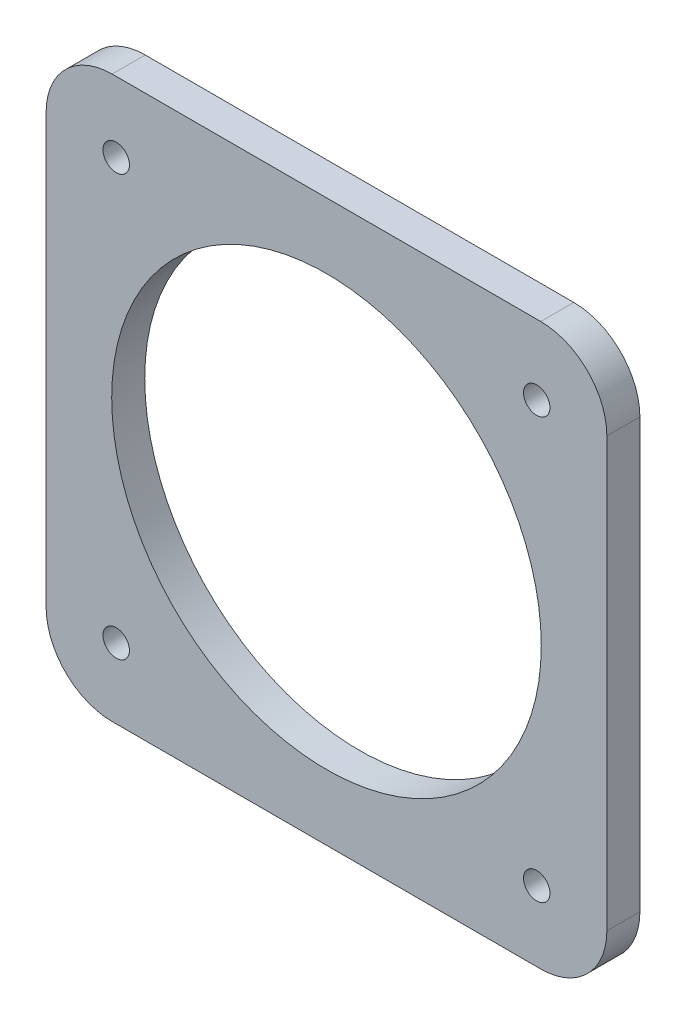
ISO-10303-21;
HEADER;
FILE_DESCRIPTION(('STEP AP214'),'2;1');
FILE_NAME('part.step','',(''),(''),'','','');
FILE_SCHEMA(('AUTOMOTIVE_DESIGN { 1 0 10303 214 1 1 1 1 }'));
ENDSEC;
DATA;
#1=APPLICATION_CONTEXT('core data for automotive mechanical design processes');
#2=APPLICATION_PROTOCOL_DEFINITION('international standard','automotive_design',2000,#1);
#3=PRODUCT_CONTEXT('',#1,'mechanical');
#4=PRODUCT('Part','Part','',(#3));
#5=PRODUCT_RELATED_PRODUCT_CATEGORY('part','',(#4));
#6=PRODUCT_DEFINITION_FORMATION('','',#4);
#7=PRODUCT_DEFINITION_CONTEXT('part definition',#1,'design');
#8=PRODUCT_DEFINITION('design','',#6,#7);
#9=PRODUCT_DEFINITION_SHAPE('','',#8);
#10=(LENGTH_UNIT() NAMED_UNIT(*) SI_UNIT(.MILLI.,.METRE.));
#11=(NAMED_UNIT(*) PLANE_ANGLE_UNIT() SI_UNIT($,.RADIAN.));
#12=(NAMED_UNIT(*) SI_UNIT($,.STERADIAN.) SOLID_ANGLE_UNIT());
#13=UNCERTAINTY_MEASURE_WITH_UNIT(LENGTH_MEASURE(1.E-05),#10,'distance_accuracy_value','');
#14=(GEOMETRIC_REPRESENTATION_CONTEXT(3) GLOBAL_UNCERTAINTY_ASSIGNED_CONTEXT((#13)) GLOBAL_UNIT_ASSIGNED_CONTEXT((#10,
#11,#12)) REPRESENTATION_CONTEXT('',''));
#15=CARTESIAN_POINT('',(0.,0.,0.));
#16=DIRECTION('',(0.,0.,1.));
#17=DIRECTION('',(1.,0.,0.));
#18=AXIS2_PLACEMENT_3D('',#15,#16,#17);
#19=CARTESIAN_POINT('',(59.3145246333828,55.4306557917285,5.));
#20=DIRECTION('',(0.,0.,-1.));
#21=DIRECTION('',(-1.,0.,0.));
#22=AXIS2_PLACEMENT_3D('',#19,#20,#21);
#23=PLANE('',#22);
#24=CARTESIAN_POINT('',(59.3145246333828,55.4306557917285,5.));
#25=DIRECTION('',(0.,0.,1.));
#26=DIRECTION('',(-1.,0.,0.));
#27=AXIS2_PLACEMENT_3D('',#24,#25,#26);
#28=CIRCLE('',#27,9.99999999999999);
#29=CARTESIAN_POINT('',(69.3145246333828,55.4306557917284,5.));
#30=VERTEX_POINT('',#29);
#31=CARTESIAN_POINT('',(59.3145246333827,65.4306557917285,5.));
#32=VERTEX_POINT('',#31);
#33=EDGE_CURVE('E145',#30,#32,#28,.T.);
#34=ORIENTED_EDGE('',*,*,#33,.T.);
#35=DIRECTION('',(-1.,0.,0.));
#36=VECTOR('',#35,1.);
#37=CARTESIAN_POINT('',(-5.53547536661714,65.4306557917285,5.));
#38=LINE('',#37,#36);
#39=CARTESIAN_POINT('',(-5.53547536661714,65.4306557917285,5.));
#40=VERTEX_POINT('',#39);
#41=EDGE_CURVE('E93',#32,#40,#38,.T.);
#42=ORIENTED_EDGE('',*,*,#41,.T.);
#43=CARTESIAN_POINT('',(-5.53547536661721,55.4306557917285,5.));
#44=DIRECTION('',(0.,0.,1.));
#45=DIRECTION('',(1.,0.,0.));
#46=AXIS2_PLACEMENT_3D('',#43,#44,#45);
#47=CIRCLE('',#46,10.);
#48=CARTESIAN_POINT('',(-15.5354753666172,55.4306557917284,5.));
#49=VERTEX_POINT('',#48);
#50=EDGE_CURVE('E160',#40,#49,#47,.T.);
#51=ORIENTED_EDGE('',*,*,#50,.T.);
#52=DIRECTION('',(0.,-1.,0.));
#53=VECTOR('',#52,1.);
#54=CARTESIAN_POINT('',(-15.5354753666172,55.4306557917284,5.));
#55=LINE('',#54,#53);
#56=CARTESIAN_POINT('',(-15.5354753666172,-9.41934420827146,5.));
#57=VERTEX_POINT('',#56);
#58=EDGE_CURVE('E173',#49,#57,#55,.T.);
#59=ORIENTED_EDGE('',*,*,#58,.T.);
#60=CARTESIAN_POINT('',(-5.5354753666172,-9.41934420827153,5.));
#61=DIRECTION('',(0.,0.,1.));
#62=DIRECTION('',(1.,0.,0.));
#63=AXIS2_PLACEMENT_3D('',#60,#61,#62);
#64=CIRCLE('',#63,10.);
#65=CARTESIAN_POINT('',(-5.53547536661713,-19.4193442082715,5.));
#66=VERTEX_POINT('',#65);
#67=EDGE_CURVE('E112',#57,#66,#64,.T.);
#68=ORIENTED_EDGE('',*,*,#67,.T.);
#69=DIRECTION('',(1.,0.,0.));
#70=VECTOR('',#69,1.);
#71=CARTESIAN_POINT('',(-5.53547536661713,-19.4193442082715,5.));
#72=LINE('',#71,#70);
#73=CARTESIAN_POINT('',(59.3145246333827,-19.4193442082715,5.));
#74=VERTEX_POINT('',#73);
#75=EDGE_CURVE('E106',#66,#74,#72,.T.);
#76=ORIENTED_EDGE('',*,*,#75,.T.);
#77=CARTESIAN_POINT('',(59.3145246333828,-9.41934420827153,5.));
#78=DIRECTION('',(0.,0.,1.));
#79=DIRECTION('',(1.,0.,0.));
#80=AXIS2_PLACEMENT_3D('',#77,#78,#79);
#81=CIRCLE('',#80,10.);
#82=CARTESIAN_POINT('',(69.3145246333828,-9.41934420827153,5.));
#83=VERTEX_POINT('',#82);
#84=EDGE_CURVE('E110',#74,#83,#81,.T.);
#85=ORIENTED_EDGE('',*,*,#84,.T.);
#86=DIRECTION('',(0.,1.,0.));
#87=VECTOR('',#86,1.);
#88=CARTESIAN_POINT('',(69.3145246333828,55.4306557917284,5.));
#89=LINE('',#88,#87);
#90=EDGE_CURVE('E50',#83,#30,#89,.T.);
#91=ORIENTED_EDGE('',*,*,#90,.T.);
#92=EDGE_LOOP('',(#34,#42,#51,#59,#68,#76,#85,#91));
#93=FACE_BOUND('',#92,.T.);
#94=CARTESIAN_POINT('',(26.8895246333828,23.0056557917285,5.));
#95=DIRECTION('',(0.,0.,1.));
#96=DIRECTION('',(1.,0.,0.));
#97=AXIS2_PLACEMENT_3D('',#94,#95,#96);
#98=CIRCLE('',#97,32.5);
#99=CARTESIAN_POINT('',(59.3895246333828,23.0056557917285,5.));
#100=VERTEX_POINT('',#99);
#101=EDGE_CURVE('E134',#100,#100,#98,.T.);
#102=ORIENTED_EDGE('',*,*,#101,.F.);
#103=EDGE_LOOP('',(#102));
#104=FACE_BOUND('',#103,.T.);
#105=CARTESIAN_POINT('',(-4.92547536661721,54.8206557917285,5.));
#106=DIRECTION('',(0.,0.,1.));
#107=DIRECTION('',(1.,0.,0.));
#108=AXIS2_PLACEMENT_3D('',#105,#106,#107);
#109=CIRCLE('',#108,2.);
#110=CARTESIAN_POINT('',(-2.92547536661721,54.8206557917285,5.));
#111=VERTEX_POINT('',#110);
#112=EDGE_CURVE('E182',#111,#111,#109,.T.);
#113=ORIENTED_EDGE('',*,*,#112,.F.);
#114=EDGE_LOOP('',(#113));
#115=FACE_BOUND('',#114,.T.);
#116=CARTESIAN_POINT('',(-4.92547536661721,-8.80934420827153,5.));
#117=DIRECTION('',(0.,0.,1.));
#118=DIRECTION('',(1.,0.,0.));
#119=AXIS2_PLACEMENT_3D('',#116,#117,#118);
#120=CIRCLE('',#119,2.);
#121=CARTESIAN_POINT('',(-2.92547536661721,-8.80934420827153,5.));
#122=VERTEX_POINT('',#121);
#123=EDGE_CURVE('E188',#122,#122,#120,.T.);
#124=ORIENTED_EDGE('',*,*,#123,.F.);
#125=EDGE_LOOP('',(#124));
#126=FACE_BOUND('',#125,.T.);
#127=CARTESIAN_POINT('',(58.7045246333828,54.8206557917285,5.));
#128=DIRECTION('',(0.,0.,1.));
#129=DIRECTION('',(1.,0.,0.));
#130=AXIS2_PLACEMENT_3D('',#127,#128,#129);
#131=CIRCLE('',#130,2.);
#132=CARTESIAN_POINT('',(60.7045246333828,54.8206557917285,5.));
#133=VERTEX_POINT('',#132);
#134=EDGE_CURVE('E194',#133,#133,#131,.T.);
#135=ORIENTED_EDGE('',*,*,#134,.F.);
#136=EDGE_LOOP('',(#135));
#137=FACE_BOUND('',#136,.T.);
#138=CARTESIAN_POINT('',(58.7045246333828,-8.80934420827153,5.));
#139=DIRECTION('',(0.,0.,1.));
#140=DIRECTION('',(1.,0.,0.));
#141=AXIS2_PLACEMENT_3D('',#138,#139,#140);
#142=CIRCLE('',#141,2.);
#143=CARTESIAN_POINT('',(60.7045246333828,-8.80934420827153,5.));
#144=VERTEX_POINT('',#143);
#145=EDGE_CURVE('E200',#144,#144,#142,.T.);
#146=ORIENTED_EDGE('',*,*,#145,.F.);
#147=EDGE_LOOP('',(#146));
#148=FACE_BOUND('',#147,.T.);
#149=ADVANCED_FACE('F33',(#93,#104,#115,#126,#137,#148),#23,.F.);
#150=CARTESIAN_POINT('',(59.3145246333828,55.4306557917285,0.));
#151=DIRECTION('',(0.,0.,-1.));
#152=DIRECTION('',(-1.,0.,0.));
#153=AXIS2_PLACEMENT_3D('',#150,#151,#152);
#154=PLANE('',#153);
#155=CARTESIAN_POINT('',(58.7045246333828,54.8206557917285,0.));
#156=DIRECTION('',(0.,0.,1.));
#157=DIRECTION('',(1.,0.,0.));
#158=AXIS2_PLACEMENT_3D('',#155,#156,#157);
#159=CIRCLE('',#158,2.);
#160=CARTESIAN_POINT('',(60.7045246333828,54.8206557917285,0.));
#161=VERTEX_POINT('',#160);
#162=EDGE_CURVE('E197',#161,#161,#159,.T.);
#163=ORIENTED_EDGE('',*,*,#162,.T.);
#164=EDGE_LOOP('',(#163));
#165=FACE_BOUND('',#164,.T.);
#166=CARTESIAN_POINT('',(-4.92547536661721,54.8206557917285,0.));
#167=DIRECTION('',(0.,0.,1.));
#168=DIRECTION('',(1.,0.,0.));
#169=AXIS2_PLACEMENT_3D('',#166,#167,#168);
#170=CIRCLE('',#169,2.);
#171=CARTESIAN_POINT('',(-2.92547536661721,54.8206557917285,0.));
#172=VERTEX_POINT('',#171);
#173=EDGE_CURVE('E185',#172,#172,#170,.T.);
#174=ORIENTED_EDGE('',*,*,#173,.T.);
#175=EDGE_LOOP('',(#174));
#176=FACE_BOUND('',#175,.T.);
#177=CARTESIAN_POINT('',(59.3145246333828,55.4306557917285,0.));
#178=DIRECTION('',(0.,0.,1.));
#179=DIRECTION('',(-1.,0.,0.));
#180=AXIS2_PLACEMENT_3D('',#177,#178,#179);
#181=CIRCLE('',#180,9.99999999999999);
#182=CARTESIAN_POINT('',(69.3145246333828,55.4306557917284,0.));
#183=VERTEX_POINT('',#182);
#184=CARTESIAN_POINT('',(59.3145246333827,65.4306557917285,0.));
#185=VERTEX_POINT('',#184);
#186=EDGE_CURVE('E130',#183,#185,#181,.T.);
#187=ORIENTED_EDGE('',*,*,#186,.F.);
#188=DIRECTION('',(0.,1.,0.));
#189=VECTOR('',#188,1.);
#190=CARTESIAN_POINT('',(69.3145246333828,55.4306557917284,0.));
#191=LINE('',#190,#189);
#192=CARTESIAN_POINT('',(69.3145246333828,-9.41934420827153,0.));
#193=VERTEX_POINT('',#192);
#194=EDGE_CURVE('E85',#193,#183,#191,.T.);
#195=ORIENTED_EDGE('',*,*,#194,.F.);
#196=CARTESIAN_POINT('',(59.3145246333828,-9.41934420827153,0.));
#197=DIRECTION('',(0.,0.,1.));
#198=DIRECTION('',(1.,0.,0.));
#199=AXIS2_PLACEMENT_3D('',#196,#197,#198);
#200=CIRCLE('',#199,10.);
#201=CARTESIAN_POINT('',(59.3145246333827,-19.4193442082715,0.));
#202=VERTEX_POINT('',#201);
#203=EDGE_CURVE('E79',#202,#193,#200,.T.);
#204=ORIENTED_EDGE('',*,*,#203,.F.);
#205=DIRECTION('',(1.,0.,0.));
#206=VECTOR('',#205,1.);
#207=CARTESIAN_POINT('',(-5.53547536661713,-19.4193442082715,0.));
#208=LINE('',#207,#206);
#209=CARTESIAN_POINT('',(-5.53547536661713,-19.4193442082715,0.));
#210=VERTEX_POINT('',#209);
#211=EDGE_CURVE('E120',#210,#202,#208,.T.);
#212=ORIENTED_EDGE('',*,*,#211,.F.);
#213=CARTESIAN_POINT('',(-5.5354753666172,-9.41934420827153,0.));
#214=DIRECTION('',(0.,0.,1.));
#215=DIRECTION('',(1.,0.,0.));
#216=AXIS2_PLACEMENT_3D('',#213,#214,#215);
#217=CIRCLE('',#216,10.);
#218=CARTESIAN_POINT('',(-15.5354753666172,-9.41934420827146,0.));
#219=VERTEX_POINT('',#218);
#220=EDGE_CURVE('E140',#219,#210,#217,.T.);
#221=ORIENTED_EDGE('',*,*,#220,.F.);
#222=DIRECTION('',(0.,-1.,0.));
#223=VECTOR('',#222,1.);
#224=CARTESIAN_POINT('',(-15.5354753666172,55.4306557917284,0.));
#225=LINE('',#224,#223);
#226=CARTESIAN_POINT('',(-15.5354753666172,55.4306557917284,0.));
#227=VERTEX_POINT('',#226);
#228=EDGE_CURVE('E138',#227,#219,#225,.T.);
#229=ORIENTED_EDGE('',*,*,#228,.F.);
#230=CARTESIAN_POINT('',(-5.53547536661721,55.4306557917285,0.));
#231=DIRECTION('',(0.,0.,1.));
#232=DIRECTION('',(1.,0.,0.));
#233=AXIS2_PLACEMENT_3D('',#230,#231,#232);
#234=CIRCLE('',#233,10.);
#235=CARTESIAN_POINT('',(-5.53547536661714,65.4306557917285,0.));
#236=VERTEX_POINT('',#235);
#237=EDGE_CURVE('E136',#236,#227,#234,.T.);
#238=ORIENTED_EDGE('',*,*,#237,.F.);
#239=DIRECTION('',(-1.,0.,0.));
#240=VECTOR('',#239,1.);
#241=CARTESIAN_POINT('',(-5.53547536661714,65.4306557917285,0.));
#242=LINE('',#241,#240);
#243=EDGE_CURVE('E133',#185,#236,#242,.T.);
#244=ORIENTED_EDGE('',*,*,#243,.F.);
#245=EDGE_LOOP('',(#187,#195,#204,#212,#221,#229,#238,#244));
#246=FACE_BOUND('',#245,.T.);
#247=CARTESIAN_POINT('',(26.8895246333828,23.0056557917285,0.));
#248=DIRECTION('',(0.,0.,1.));
#249=DIRECTION('',(1.,0.,0.));
#250=AXIS2_PLACEMENT_3D('',#247,#248,#249);
#251=CIRCLE('',#250,32.5);
#252=CARTESIAN_POINT('',(59.3895246333828,23.0056557917285,0.));
#253=VERTEX_POINT('',#252);
#254=EDGE_CURVE('E179',#253,#253,#251,.T.);
#255=ORIENTED_EDGE('',*,*,#254,.T.);
#256=EDGE_LOOP('',(#255));
#257=FACE_BOUND('',#256,.T.);
#258=CARTESIAN_POINT('',(-4.92547536661721,-8.80934420827153,0.));
#259=DIRECTION('',(0.,0.,1.));
#260=DIRECTION('',(1.,0.,0.));
#261=AXIS2_PLACEMENT_3D('',#258,#259,#260);
#262=CIRCLE('',#261,2.);
#263=CARTESIAN_POINT('',(-2.92547536661721,-8.80934420827153,0.));
#264=VERTEX_POINT('',#263);
#265=EDGE_CURVE('E191',#264,#264,#262,.T.);
#266=ORIENTED_EDGE('',*,*,#265,.T.);
#267=EDGE_LOOP('',(#266));
#268=FACE_BOUND('',#267,.T.);
#269=CARTESIAN_POINT('',(58.7045246333828,-8.80934420827153,0.));
#270=DIRECTION('',(0.,0.,1.));
#271=DIRECTION('',(1.,0.,0.));
#272=AXIS2_PLACEMENT_3D('',#269,#270,#271);
#273=CIRCLE('',#272,2.);
#274=CARTESIAN_POINT('',(60.7045246333828,-8.80934420827153,0.));
#275=VERTEX_POINT('',#274);
#276=EDGE_CURVE('E203',#275,#275,#273,.T.);
#277=ORIENTED_EDGE('',*,*,#276,.T.);
#278=EDGE_LOOP('',(#277));
#279=FACE_BOUND('',#278,.T.);
#280=ADVANCED_FACE('F164',(#165,#176,#246,#257,#268,#279),#154,.T.);
#281=CARTESIAN_POINT('',(59.3145246333828,55.4306557917285,5.));
#282=DIRECTION('',(0.,0.,-1.));
#283=DIRECTION('',(-1.,0.,0.));
#284=AXIS2_PLACEMENT_3D('',#281,#282,#283);
#285=CYLINDRICAL_SURFACE('',#284,9.99999999999999);
#286=ORIENTED_EDGE('',*,*,#186,.T.);
#287=DIRECTION('',(0.,0.,-1.));
#288=VECTOR('',#287,1.);
#289=CARTESIAN_POINT('',(59.3145246333827,65.4306557917285,5.));
#290=LINE('',#289,#288);
#291=EDGE_CURVE('E11',#32,#185,#290,.T.);
#292=ORIENTED_EDGE('',*,*,#291,.F.);
#293=ORIENTED_EDGE('',*,*,#33,.F.);
#294=DIRECTION('',(0.,0.,-1.));
#295=VECTOR('',#294,1.);
#296=CARTESIAN_POINT('',(69.3145246333828,55.4306557917284,5.));
#297=LINE('',#296,#295);
#298=EDGE_CURVE('E126',#30,#183,#297,.T.);
#299=ORIENTED_EDGE('',*,*,#298,.T.);
#300=EDGE_LOOP('',(#286,#292,#293,#299));
#301=FACE_BOUND('',#300,.T.);
#302=ADVANCED_FACE('F35',(#301),#285,.T.);
#303=CARTESIAN_POINT('',(-5.53547536661714,65.4306557917285,5.));
#304=DIRECTION('',(0.,-1.,0.));
#305=DIRECTION('',(0.,0.,-1.));
#306=AXIS2_PLACEMENT_3D('',#303,#304,#305);
#307=PLANE('',#306);
#308=ORIENTED_EDGE('',*,*,#243,.T.);
#309=DIRECTION('',(0.,0.,-1.));
#310=VECTOR('',#309,1.);
#311=CARTESIAN_POINT('',(-5.53547536661714,65.4306557917285,5.));
#312=LINE('',#311,#310);
#313=EDGE_CURVE('E42',#40,#236,#312,.T.);
#314=ORIENTED_EDGE('',*,*,#313,.F.);
#315=ORIENTED_EDGE('',*,*,#41,.F.);
#316=ORIENTED_EDGE('',*,*,#291,.T.);
#317=EDGE_LOOP('',(#308,#314,#315,#316));
#318=FACE_BOUND('',#317,.T.);
#319=ADVANCED_FACE('F235',(#318),#307,.F.);
#320=CARTESIAN_POINT('',(-5.53547536661721,55.4306557917285,5.));
#321=DIRECTION('',(0.,0.,-1.));
#322=DIRECTION('',(-1.,0.,0.));
#323=AXIS2_PLACEMENT_3D('',#320,#321,#322);
#324=CYLINDRICAL_SURFACE('',#323,10.);
#325=ORIENTED_EDGE('',*,*,#237,.T.);
#326=DIRECTION('',(0.,0.,-1.));
#327=VECTOR('',#326,1.);
#328=CARTESIAN_POINT('',(-15.5354753666172,55.4306557917284,5.));
#329=LINE('',#328,#327);
#330=EDGE_CURVE('E152',#49,#227,#329,.T.);
#331=ORIENTED_EDGE('',*,*,#330,.F.);
#332=ORIENTED_EDGE('',*,*,#50,.F.);
#333=ORIENTED_EDGE('',*,*,#313,.T.);
#334=EDGE_LOOP('',(#325,#331,#332,#333));
#335=FACE_BOUND('',#334,.T.);
#336=ADVANCED_FACE('F158',(#335),#324,.T.);
#337=CARTESIAN_POINT('',(-15.5354753666172,55.4306557917284,5.));
#338=DIRECTION('',(1.,0.,0.));
#339=DIRECTION('',(0.,1.,0.));
#340=AXIS2_PLACEMENT_3D('',#337,#338,#339);
#341=PLANE('',#340);
#342=ORIENTED_EDGE('',*,*,#228,.T.);
#343=DIRECTION('',(0.,0.,-1.));
#344=VECTOR('',#343,1.);
#345=CARTESIAN_POINT('',(-15.5354753666172,-9.41934420827146,5.));
#346=LINE('',#345,#344);
#347=EDGE_CURVE('E149',#57,#219,#346,.T.);
#348=ORIENTED_EDGE('',*,*,#347,.F.);
#349=ORIENTED_EDGE('',*,*,#58,.F.);
#350=ORIENTED_EDGE('',*,*,#330,.T.);
#351=EDGE_LOOP('',(#342,#348,#349,#350));
#352=FACE_BOUND('',#351,.T.);
#353=ADVANCED_FACE('F169',(#352),#341,.F.);
#354=CARTESIAN_POINT('',(-5.5354753666172,-9.41934420827153,5.));
#355=DIRECTION('',(0.,0.,-1.));
#356=DIRECTION('',(-1.,0.,0.));
#357=AXIS2_PLACEMENT_3D('',#354,#355,#356);
#358=CYLINDRICAL_SURFACE('',#357,10.);
#359=ORIENTED_EDGE('',*,*,#220,.T.);
#360=DIRECTION('',(0.,0.,-1.));
#361=VECTOR('',#360,1.);
#362=CARTESIAN_POINT('',(-5.53547536661713,-19.4193442082715,5.));
#363=LINE('',#362,#361);
#364=EDGE_CURVE('E121',#66,#210,#363,.T.);
#365=ORIENTED_EDGE('',*,*,#364,.F.);
#366=ORIENTED_EDGE('',*,*,#67,.F.);
#367=ORIENTED_EDGE('',*,*,#347,.T.);
#368=EDGE_LOOP('',(#359,#365,#366,#367));
#369=FACE_BOUND('',#368,.T.);
#370=ADVANCED_FACE('F172',(#369),#358,.T.);
#371=CARTESIAN_POINT('',(-5.53547536661713,-19.4193442082715,5.));
#372=DIRECTION('',(0.,1.,0.));
#373=DIRECTION('',(0.,0.,1.));
#374=AXIS2_PLACEMENT_3D('',#371,#372,#373);
#375=PLANE('',#374);
#376=ORIENTED_EDGE('',*,*,#211,.T.);
#377=DIRECTION('',(0.,0.,-1.));
#378=VECTOR('',#377,1.);
#379=CARTESIAN_POINT('',(59.3145246333827,-19.4193442082715,5.));
#380=LINE('',#379,#378);
#381=EDGE_CURVE('E117',#74,#202,#380,.T.);
#382=ORIENTED_EDGE('',*,*,#381,.F.);
#383=ORIENTED_EDGE('',*,*,#75,.F.);
#384=ORIENTED_EDGE('',*,*,#364,.T.);
#385=EDGE_LOOP('',(#376,#382,#383,#384));
#386=FACE_BOUND('',#385,.T.);
#387=ADVANCED_FACE('F118',(#386),#375,.F.);
#388=CARTESIAN_POINT('',(59.3145246333828,-9.41934420827153,5.));
#389=DIRECTION('',(0.,0.,-1.));
#390=DIRECTION('',(-1.,0.,0.));
#391=AXIS2_PLACEMENT_3D('',#388,#389,#390);
#392=CYLINDRICAL_SURFACE('',#391,10.);
#393=ORIENTED_EDGE('',*,*,#203,.T.);
#394=DIRECTION('',(0.,0.,-1.));
#395=VECTOR('',#394,1.);
#396=CARTESIAN_POINT('',(69.3145246333828,-9.41934420827153,5.));
#397=LINE('',#396,#395);
#398=EDGE_CURVE('E122',#83,#193,#397,.T.);
#399=ORIENTED_EDGE('',*,*,#398,.F.);
#400=ORIENTED_EDGE('',*,*,#84,.F.);
#401=ORIENTED_EDGE('',*,*,#381,.T.);
#402=EDGE_LOOP('',(#393,#399,#400,#401));
#403=FACE_BOUND('',#402,.T.);
#404=ADVANCED_FACE('F124',(#403),#392,.T.);
#405=CARTESIAN_POINT('',(69.3145246333828,55.4306557917284,5.));
#406=DIRECTION('',(-1.,0.,0.));
#407=DIRECTION('',(0.,0.,1.));
#408=AXIS2_PLACEMENT_3D('',#405,#406,#407);
#409=PLANE('',#408);
#410=ORIENTED_EDGE('',*,*,#194,.T.);
#411=ORIENTED_EDGE('',*,*,#298,.F.);
#412=ORIENTED_EDGE('',*,*,#90,.F.);
#413=ORIENTED_EDGE('',*,*,#398,.T.);
#414=EDGE_LOOP('',(#410,#411,#412,#413));
#415=FACE_BOUND('',#414,.T.);
#416=ADVANCED_FACE('F223',(#415),#409,.F.);
#417=CARTESIAN_POINT('',(26.8895246333828,23.0056557917285,5.));
#418=DIRECTION('',(0.,0.,-1.));
#419=DIRECTION('',(-1.,0.,0.));
#420=AXIS2_PLACEMENT_3D('',#417,#418,#419);
#421=CYLINDRICAL_SURFACE('',#420,32.5);
#422=ORIENTED_EDGE('',*,*,#101,.T.);
#423=EDGE_LOOP('',(#422));
#424=FACE_BOUND('',#423,.T.);
#425=ORIENTED_EDGE('',*,*,#254,.F.);
#426=EDGE_LOOP('',(#425));
#427=FACE_BOUND('',#426,.T.);
#428=ADVANCED_FACE('F220',(#424,#427),#421,.F.);
#429=CARTESIAN_POINT('',(-4.92547536661721,54.8206557917285,5.));
#430=DIRECTION('',(0.,0.,-1.));
#431=DIRECTION('',(-1.,0.,0.));
#432=AXIS2_PLACEMENT_3D('',#429,#430,#431);
#433=CYLINDRICAL_SURFACE('',#432,2.);
#434=ORIENTED_EDGE('',*,*,#112,.T.);
#435=EDGE_LOOP('',(#434));
#436=FACE_BOUND('',#435,.T.);
#437=ORIENTED_EDGE('',*,*,#173,.F.);
#438=EDGE_LOOP('',(#437));
#439=FACE_BOUND('',#438,.T.);
#440=ADVANCED_FACE('F299',(#436,#439),#433,.F.);
#441=CARTESIAN_POINT('',(-4.92547536661721,-8.80934420827153,5.));
#442=DIRECTION('',(0.,0.,-1.));
#443=DIRECTION('',(-1.,0.,0.));
#444=AXIS2_PLACEMENT_3D('',#441,#442,#443);
#445=CYLINDRICAL_SURFACE('',#444,2.);
#446=ORIENTED_EDGE('',*,*,#123,.T.);
#447=EDGE_LOOP('',(#446));
#448=FACE_BOUND('',#447,.T.);
#449=ORIENTED_EDGE('',*,*,#265,.F.);
#450=EDGE_LOOP('',(#449));
#451=FACE_BOUND('',#450,.T.);
#452=ADVANCED_FACE('F307',(#448,#451),#445,.F.);
#453=CARTESIAN_POINT('',(58.7045246333828,54.8206557917285,5.));
#454=DIRECTION('',(0.,0.,-1.));
#455=DIRECTION('',(-1.,0.,0.));
#456=AXIS2_PLACEMENT_3D('',#453,#454,#455);
#457=CYLINDRICAL_SURFACE('',#456,2.);
#458=ORIENTED_EDGE('',*,*,#134,.T.);
#459=EDGE_LOOP('',(#458));
#460=FACE_BOUND('',#459,.T.);
#461=ORIENTED_EDGE('',*,*,#162,.F.);
#462=EDGE_LOOP('',(#461));
#463=FACE_BOUND('',#462,.T.);
#464=ADVANCED_FACE('F315',(#460,#463),#457,.F.);
#465=CARTESIAN_POINT('',(58.7045246333828,-8.80934420827153,5.));
#466=DIRECTION('',(0.,0.,-1.));
#467=DIRECTION('',(-1.,0.,0.));
#468=AXIS2_PLACEMENT_3D('',#465,#466,#467);
#469=CYLINDRICAL_SURFACE('',#468,2.);
#470=ORIENTED_EDGE('',*,*,#145,.T.);
#471=EDGE_LOOP('',(#470));
#472=FACE_BOUND('',#471,.T.);
#473=ORIENTED_EDGE('',*,*,#276,.F.);
#474=EDGE_LOOP('',(#473));
#475=FACE_BOUND('',#474,.T.);
#476=ADVANCED_FACE('F209',(#472,#475),#469,.F.);
#477=CLOSED_SHELL('',(#149,#280,#302,#319,#336,#353,#370,#387,#404,#416,#428,#440,#452,#464,#476));
#478=MANIFOLD_SOLID_BREP('B2',#477);
#479=ADVANCED_BREP_SHAPE_REPRESENTATION('',(#18,#478),#14);
#480=SHAPE_DEFINITION_REPRESENTATION(#9,#479);
ENDSEC;
END-ISO-10303-21;
